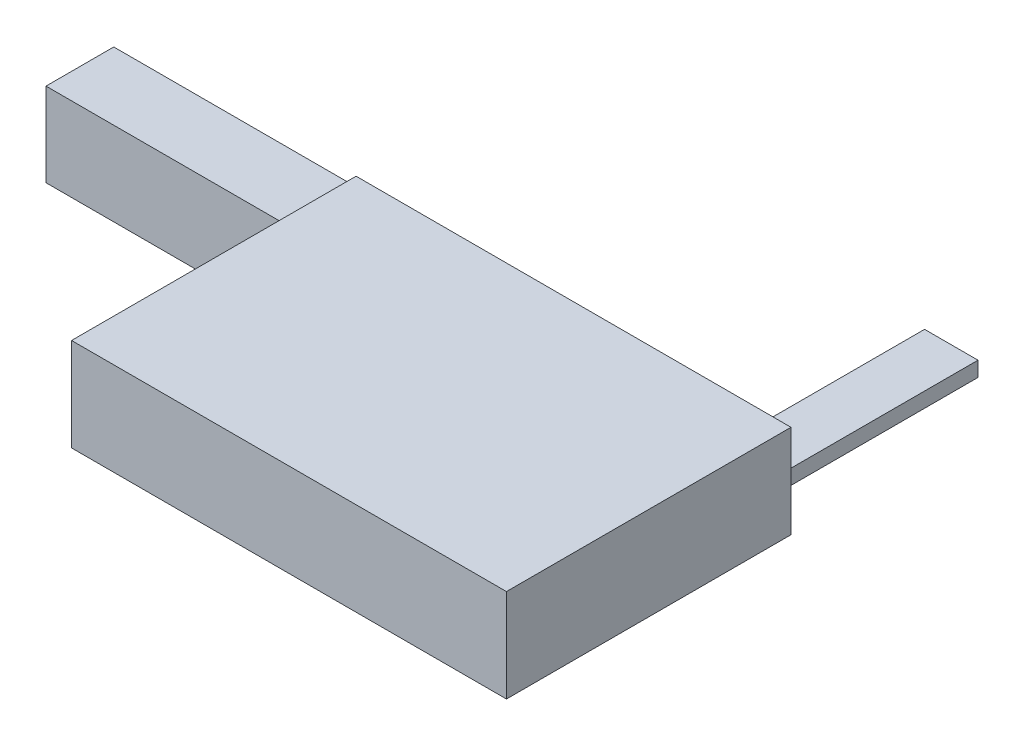
ISO-10303-21;
HEADER;
FILE_DESCRIPTION(('STEP AP214'),'2;1');
FILE_NAME('part.step','',(''),(''),'','','');
FILE_SCHEMA(('AUTOMOTIVE_DESIGN { 1 0 10303 214 1 1 1 1 }'));
ENDSEC;
DATA;
#1=APPLICATION_CONTEXT('core data for automotive mechanical design processes');
#2=APPLICATION_PROTOCOL_DEFINITION('international standard','automotive_design',2000,#1);
#3=PRODUCT_CONTEXT('',#1,'mechanical');
#4=PRODUCT('Part','Part','',(#3));
#5=PRODUCT_RELATED_PRODUCT_CATEGORY('part','',(#4));
#6=PRODUCT_DEFINITION_FORMATION('','',#4);
#7=PRODUCT_DEFINITION_CONTEXT('part definition',#1,'design');
#8=PRODUCT_DEFINITION('design','',#6,#7);
#9=PRODUCT_DEFINITION_SHAPE('','',#8);
#10=(LENGTH_UNIT() NAMED_UNIT(*) SI_UNIT(.MILLI.,.METRE.));
#11=(NAMED_UNIT(*) PLANE_ANGLE_UNIT() SI_UNIT($,.RADIAN.));
#12=(NAMED_UNIT(*) SI_UNIT($,.STERADIAN.) SOLID_ANGLE_UNIT());
#13=UNCERTAINTY_MEASURE_WITH_UNIT(LENGTH_MEASURE(1.E-05),#10,'distance_accuracy_value','');
#14=(GEOMETRIC_REPRESENTATION_CONTEXT(3) GLOBAL_UNCERTAINTY_ASSIGNED_CONTEXT((#13)) GLOBAL_UNIT_ASSIGNED_CONTEXT((#10,
#11,#12)) REPRESENTATION_CONTEXT('',''));
#15=CARTESIAN_POINT('',(0.,0.,0.));
#16=DIRECTION('',(0.,0.,1.));
#17=DIRECTION('',(1.,0.,0.));
#18=AXIS2_PLACEMENT_3D('',#15,#16,#17);
#19=CARTESIAN_POINT('',(-68.9663311951931,18.9,-21.5412378145606));
#20=DIRECTION('',(0.,0.,1.));
#21=DIRECTION('',(1.,0.,0.));
#22=AXIS2_PLACEMENT_3D('',#19,#20,#21);
#23=PLANE('',#22);
#24=DIRECTION('',(-1.,0.,0.));
#25=VECTOR('',#24,1.);
#26=CARTESIAN_POINT('',(-68.9663311951931,0.,-21.5412378145606));
#27=LINE('',#26,#25);
#28=CARTESIAN_POINT('',(19.3336688048069,0.,-21.5412378145606));
#29=VERTEX_POINT('',#28);
#30=CARTESIAN_POINT('',(-68.9663311951931,0.,-21.5412378145606));
#31=VERTEX_POINT('',#30);
#32=EDGE_CURVE('E185',#29,#31,#27,.T.);
#33=ORIENTED_EDGE('',*,*,#32,.T.);
#34=DIRECTION('',(0.,-1.,0.));
#35=VECTOR('',#34,1.);
#36=CARTESIAN_POINT('',(-68.9663311951931,18.9,-21.5412378145606));
#37=LINE('',#36,#35);
#38=CARTESIAN_POINT('',(-68.9663311951931,18.9,-21.5412378145606));
#39=VERTEX_POINT('',#38);
#40=EDGE_CURVE('E191',#39,#31,#37,.T.);
#41=ORIENTED_EDGE('',*,*,#40,.F.);
#42=DIRECTION('',(-1.,0.,0.));
#43=VECTOR('',#42,1.);
#44=CARTESIAN_POINT('',(-68.9663311951931,18.9,-21.5412378145606));
#45=LINE('',#44,#43);
#46=CARTESIAN_POINT('',(19.3336688048069,18.9,-21.5412378145606));
#47=VERTEX_POINT('',#46);
#48=EDGE_CURVE('E189',#47,#39,#45,.T.);
#49=ORIENTED_EDGE('',*,*,#48,.F.);
#50=DIRECTION('',(0.,-1.,0.));
#51=VECTOR('',#50,1.);
#52=CARTESIAN_POINT('',(19.3336688048069,18.9,-21.5412378145606));
#53=LINE('',#52,#51);
#54=EDGE_CURVE('E201',#47,#29,#53,.T.);
#55=ORIENTED_EDGE('',*,*,#54,.T.);
#56=EDGE_LOOP('',(#33,#41,#49,#55));
#57=FACE_BOUND('',#56,.T.);
#58=DIRECTION('',(0.,-1.,0.));
#59=VECTOR('',#58,1.);
#60=CARTESIAN_POINT('',(12.3031937464226,4.68327941976551,-21.5412378145606));
#61=LINE('',#60,#59);
#62=CARTESIAN_POINT('',(12.3031937464226,4.68327941976551,-21.5412378145606));
#63=VERTEX_POINT('',#62);
#64=CARTESIAN_POINT('',(12.3031937464226,1.64563042849727,-21.5412378145606));
#65=VERTEX_POINT('',#64);
#66=EDGE_CURVE('E141',#63,#65,#61,.T.);
#67=ORIENTED_EDGE('',*,*,#66,.F.);
#68=DIRECTION('',(1.,0.,0.));
#69=VECTOR('',#68,1.);
#70=CARTESIAN_POINT('',(12.3031937464226,4.68327941976551,-21.5412378145606));
#71=LINE('',#70,#69);
#72=CARTESIAN_POINT('',(1.45444734903608,4.68327941976551,-21.5412378145606));
#73=VERTEX_POINT('',#72);
#74=EDGE_CURVE('E138',#73,#63,#71,.T.);
#75=ORIENTED_EDGE('',*,*,#74,.F.);
#76=DIRECTION('',(0.,1.,0.));
#77=VECTOR('',#76,1.);
#78=CARTESIAN_POINT('',(1.45444734903608,4.68327941976551,-21.5412378145606));
#79=LINE('',#78,#77);
#80=CARTESIAN_POINT('',(1.45444734903608,1.64563042849727,-21.5412378145606));
#81=VERTEX_POINT('',#80);
#82=EDGE_CURVE('E52',#81,#73,#79,.T.);
#83=ORIENTED_EDGE('',*,*,#82,.F.);
#84=DIRECTION('',(-1.,0.,0.));
#85=VECTOR('',#84,1.);
#86=CARTESIAN_POINT('',(12.3031937464226,1.64563042849727,-21.5412378145606));
#87=LINE('',#86,#85);
#88=EDGE_CURVE('E47',#65,#81,#87,.T.);
#89=ORIENTED_EDGE('',*,*,#88,.F.);
#90=EDGE_LOOP('',(#67,#75,#83,#89));
#91=FACE_BOUND('',#90,.T.);
#92=ADVANCED_FACE('F32',(#57,#91),#23,.F.);
#93=CARTESIAN_POINT('',(-68.9663311951931,18.9,-21.5412378145606));
#94=DIRECTION('',(1.,0.,0.));
#95=DIRECTION('',(0.,0.,-1.));
#96=AXIS2_PLACEMENT_3D('',#93,#94,#95);
#97=PLANE('',#96);
#98=DIRECTION('',(0.,0.,1.));
#99=VECTOR('',#98,1.);
#100=CARTESIAN_POINT('',(-68.9663311951931,0.,-21.5412378145606));
#101=LINE('',#100,#99);
#102=CARTESIAN_POINT('',(-68.9663311951931,0.,36.2287621854394));
#103=VERTEX_POINT('',#102);
#104=EDGE_CURVE('E180',#31,#103,#101,.T.);
#105=ORIENTED_EDGE('',*,*,#104,.T.);
#106=DIRECTION('',(0.,-1.,0.));
#107=VECTOR('',#106,1.);
#108=CARTESIAN_POINT('',(-68.9663311951931,18.9,36.2287621854394));
#109=LINE('',#108,#107);
#110=CARTESIAN_POINT('',(-68.9663311951931,18.9,36.2287621854394));
#111=VERTEX_POINT('',#110);
#112=EDGE_CURVE('E11',#111,#103,#109,.T.);
#113=ORIENTED_EDGE('',*,*,#112,.F.);
#114=DIRECTION('',(0.,0.,1.));
#115=VECTOR('',#114,1.);
#116=CARTESIAN_POINT('',(-68.9663311951931,18.9,-21.5412378145606));
#117=LINE('',#116,#115);
#118=EDGE_CURVE('E181',#39,#111,#117,.T.);
#119=ORIENTED_EDGE('',*,*,#118,.F.);
#120=ORIENTED_EDGE('',*,*,#40,.T.);
#121=EDGE_LOOP('',(#105,#113,#119,#120));
#122=FACE_BOUND('',#121,.T.);
#123=DIRECTION('',(0.,-1.,0.));
#124=VECTOR('',#123,1.);
#125=CARTESIAN_POINT('',(-68.9663311951931,18.222786207606,-20.3427320089924));
#126=LINE('',#125,#124);
#127=CARTESIAN_POINT('',(-68.9663311951931,18.222786207606,-20.3427320089924));
#128=VERTEX_POINT('',#127);
#129=CARTESIAN_POINT('',(-68.9663311951931,1.22278620760602,-20.3427320089924));
#130=VERTEX_POINT('',#129);
#131=EDGE_CURVE('E142',#128,#130,#126,.T.);
#132=ORIENTED_EDGE('',*,*,#131,.F.);
#133=DIRECTION('',(0.,0.,-1.));
#134=VECTOR('',#133,1.);
#135=CARTESIAN_POINT('',(-68.9663311951931,18.222786207606,-20.3427320089924));
#136=LINE('',#135,#134);
#137=CARTESIAN_POINT('',(-68.9663311951931,18.222786207606,-6.58273200899241));
#138=VERTEX_POINT('',#137);
#139=EDGE_CURVE('E155',#138,#128,#136,.T.);
#140=ORIENTED_EDGE('',*,*,#139,.F.);
#141=DIRECTION('',(0.,1.,0.));
#142=VECTOR('',#141,1.);
#143=CARTESIAN_POINT('',(-68.9663311951931,18.222786207606,-6.58273200899241));
#144=LINE('',#143,#142);
#145=CARTESIAN_POINT('',(-68.9663311951931,1.22278620760602,-6.58273200899241));
#146=VERTEX_POINT('',#145);
#147=EDGE_CURVE('E164',#146,#138,#144,.T.);
#148=ORIENTED_EDGE('',*,*,#147,.F.);
#149=DIRECTION('',(0.,0.,1.));
#150=VECTOR('',#149,1.);
#151=CARTESIAN_POINT('',(-68.9663311951931,1.22278620760602,-20.3427320089924));
#152=LINE('',#151,#150);
#153=EDGE_CURVE('E145',#130,#146,#152,.T.);
#154=ORIENTED_EDGE('',*,*,#153,.F.);
#155=EDGE_LOOP('',(#132,#140,#148,#154));
#156=FACE_BOUND('',#155,.T.);
#157=ADVANCED_FACE('F34',(#122,#156),#97,.F.);
#158=CARTESIAN_POINT('',(-68.9663311951931,18.9,36.2287621854394));
#159=DIRECTION('',(0.,0.,-1.));
#160=DIRECTION('',(-1.,0.,0.));
#161=AXIS2_PLACEMENT_3D('',#158,#159,#160);
#162=PLANE('',#161);
#163=DIRECTION('',(1.,0.,0.));
#164=VECTOR('',#163,1.);
#165=CARTESIAN_POINT('',(-68.9663311951931,0.,36.2287621854394));
#166=LINE('',#165,#164);
#167=CARTESIAN_POINT('',(19.3336688048069,0.,36.2287621854394));
#168=VERTEX_POINT('',#167);
#169=EDGE_CURVE('E194',#103,#168,#166,.T.);
#170=ORIENTED_EDGE('',*,*,#169,.T.);
#171=DIRECTION('',(0.,-1.,0.));
#172=VECTOR('',#171,1.);
#173=CARTESIAN_POINT('',(19.3336688048069,18.9,36.2287621854394));
#174=LINE('',#173,#172);
#175=CARTESIAN_POINT('',(19.3336688048069,18.9,36.2287621854394));
#176=VERTEX_POINT('',#175);
#177=EDGE_CURVE('E40',#176,#168,#174,.T.);
#178=ORIENTED_EDGE('',*,*,#177,.F.);
#179=DIRECTION('',(1.,0.,0.));
#180=VECTOR('',#179,1.);
#181=CARTESIAN_POINT('',(-68.9663311951931,18.9,36.2287621854394));
#182=LINE('',#181,#180);
#183=EDGE_CURVE('E184',#111,#176,#182,.T.);
#184=ORIENTED_EDGE('',*,*,#183,.F.);
#185=ORIENTED_EDGE('',*,*,#112,.T.);
#186=EDGE_LOOP('',(#170,#178,#184,#185));
#187=FACE_BOUND('',#186,.T.);
#188=ADVANCED_FACE('F224',(#187),#162,.F.);
#189=CARTESIAN_POINT('',(19.3336688048069,18.9,-21.5412378145606));
#190=DIRECTION('',(-1.,0.,0.));
#191=DIRECTION('',(0.,0.,1.));
#192=AXIS2_PLACEMENT_3D('',#189,#190,#191);
#193=PLANE('',#192);
#194=DIRECTION('',(0.,0.,-1.));
#195=VECTOR('',#194,1.);
#196=CARTESIAN_POINT('',(19.3336688048069,0.,-21.5412378145606));
#197=LINE('',#196,#195);
#198=EDGE_CURVE('E196',#168,#29,#197,.T.);
#199=ORIENTED_EDGE('',*,*,#198,.T.);
#200=ORIENTED_EDGE('',*,*,#54,.F.);
#201=DIRECTION('',(0.,0.,-1.));
#202=VECTOR('',#201,1.);
#203=CARTESIAN_POINT('',(19.3336688048069,18.9,-21.5412378145606));
#204=LINE('',#203,#202);
#205=EDGE_CURVE('E187',#176,#47,#204,.T.);
#206=ORIENTED_EDGE('',*,*,#205,.F.);
#207=ORIENTED_EDGE('',*,*,#177,.T.);
#208=EDGE_LOOP('',(#199,#200,#206,#207));
#209=FACE_BOUND('',#208,.T.);
#210=ADVANCED_FACE('F208',(#209),#193,.F.);
#211=CARTESIAN_POINT('',(0.,18.9,0.));
#212=DIRECTION('',(0.,1.,0.));
#213=DIRECTION('',(0.,0.,1.));
#214=AXIS2_PLACEMENT_3D('',#211,#212,#213);
#215=PLANE('',#214);
#216=ORIENTED_EDGE('',*,*,#118,.T.);
#217=ORIENTED_EDGE('',*,*,#183,.T.);
#218=ORIENTED_EDGE('',*,*,#205,.T.);
#219=ORIENTED_EDGE('',*,*,#48,.T.);
#220=EDGE_LOOP('',(#216,#217,#218,#219));
#221=FACE_BOUND('',#220,.T.);
#222=ADVANCED_FACE('F223',(#221),#215,.T.);
#223=CARTESIAN_POINT('',(0.,0.,0.));
#224=DIRECTION('',(0.,1.,0.));
#225=DIRECTION('',(0.,0.,1.));
#226=AXIS2_PLACEMENT_3D('',#223,#224,#225);
#227=PLANE('',#226);
#228=ORIENTED_EDGE('',*,*,#104,.F.);
#229=ORIENTED_EDGE('',*,*,#32,.F.);
#230=ORIENTED_EDGE('',*,*,#198,.F.);
#231=ORIENTED_EDGE('',*,*,#169,.F.);
#232=EDGE_LOOP('',(#228,#229,#230,#231));
#233=FACE_BOUND('',#232,.T.);
#234=ADVANCED_FACE('F214',(#233),#227,.F.);
#235=CARTESIAN_POINT('',(-116.966331195193,18.222786207606,-20.3427320089924));
#236=DIRECTION('',(0.,0.,1.));
#237=DIRECTION('',(0.,-1.,0.));
#238=AXIS2_PLACEMENT_3D('',#235,#236,#237);
#239=PLANE('',#238);
#240=ORIENTED_EDGE('',*,*,#131,.T.);
#241=DIRECTION('',(1.,0.,0.));
#242=VECTOR('',#241,1.);
#243=CARTESIAN_POINT('',(-116.966331195193,1.22278620760602,-20.3427320089924));
#244=LINE('',#243,#242);
#245=CARTESIAN_POINT('',(-116.966331195193,1.22278620760602,-20.3427320089924));
#246=VERTEX_POINT('',#245);
#247=EDGE_CURVE('E177',#246,#130,#244,.T.);
#248=ORIENTED_EDGE('',*,*,#247,.F.);
#249=DIRECTION('',(0.,-1.,0.));
#250=VECTOR('',#249,1.);
#251=CARTESIAN_POINT('',(-116.966331195193,18.222786207606,-20.3427320089924));
#252=LINE('',#251,#250);
#253=CARTESIAN_POINT('',(-116.966331195193,18.222786207606,-20.3427320089924));
#254=VERTEX_POINT('',#253);
#255=EDGE_CURVE('E151',#254,#246,#252,.T.);
#256=ORIENTED_EDGE('',*,*,#255,.F.);
#257=DIRECTION('',(1.,0.,0.));
#258=VECTOR('',#257,1.);
#259=CARTESIAN_POINT('',(-116.966331195193,18.222786207606,-20.3427320089924));
#260=LINE('',#259,#258);
#261=EDGE_CURVE('E160',#254,#128,#260,.T.);
#262=ORIENTED_EDGE('',*,*,#261,.T.);
#263=EDGE_LOOP('',(#240,#248,#256,#262));
#264=FACE_BOUND('',#263,.T.);
#265=ADVANCED_FACE('F238',(#264),#239,.F.);
#266=CARTESIAN_POINT('',(-116.966331195193,1.22278620760602,-20.3427320089924));
#267=DIRECTION('',(0.,1.,0.));
#268=DIRECTION('',(0.,0.,1.));
#269=AXIS2_PLACEMENT_3D('',#266,#267,#268);
#270=PLANE('',#269);
#271=ORIENTED_EDGE('',*,*,#153,.T.);
#272=DIRECTION('',(1.,0.,0.));
#273=VECTOR('',#272,1.);
#274=CARTESIAN_POINT('',(-116.966331195193,1.22278620760602,-6.58273200899241));
#275=LINE('',#274,#273);
#276=CARTESIAN_POINT('',(-116.966331195193,1.22278620760602,-6.58273200899241));
#277=VERTEX_POINT('',#276);
#278=EDGE_CURVE('E174',#277,#146,#275,.T.);
#279=ORIENTED_EDGE('',*,*,#278,.F.);
#280=DIRECTION('',(0.,0.,1.));
#281=VECTOR('',#280,1.);
#282=CARTESIAN_POINT('',(-116.966331195193,1.22278620760602,-20.3427320089924));
#283=LINE('',#282,#281);
#284=EDGE_CURVE('E154',#246,#277,#283,.T.);
#285=ORIENTED_EDGE('',*,*,#284,.F.);
#286=ORIENTED_EDGE('',*,*,#247,.T.);
#287=EDGE_LOOP('',(#271,#279,#285,#286));
#288=FACE_BOUND('',#287,.T.);
#289=ADVANCED_FACE('F243',(#288),#270,.F.);
#290=CARTESIAN_POINT('',(-116.966331195193,18.222786207606,-6.58273200899241));
#291=DIRECTION('',(0.,0.,-1.));
#292=DIRECTION('',(-1.,0.,0.));
#293=AXIS2_PLACEMENT_3D('',#290,#291,#292);
#294=PLANE('',#293);
#295=ORIENTED_EDGE('',*,*,#147,.T.);
#296=DIRECTION('',(1.,0.,0.));
#297=VECTOR('',#296,1.);
#298=CARTESIAN_POINT('',(-116.966331195193,18.222786207606,-6.58273200899241));
#299=LINE('',#298,#297);
#300=CARTESIAN_POINT('',(-116.966331195193,18.222786207606,-6.58273200899241));
#301=VERTEX_POINT('',#300);
#302=EDGE_CURVE('E171',#301,#138,#299,.T.);
#303=ORIENTED_EDGE('',*,*,#302,.F.);
#304=DIRECTION('',(0.,1.,0.));
#305=VECTOR('',#304,1.);
#306=CARTESIAN_POINT('',(-116.966331195193,18.222786207606,-6.58273200899241));
#307=LINE('',#306,#305);
#308=EDGE_CURVE('E157',#277,#301,#307,.T.);
#309=ORIENTED_EDGE('',*,*,#308,.F.);
#310=ORIENTED_EDGE('',*,*,#278,.T.);
#311=EDGE_LOOP('',(#295,#303,#309,#310));
#312=FACE_BOUND('',#311,.T.);
#313=ADVANCED_FACE('F247',(#312),#294,.F.);
#314=CARTESIAN_POINT('',(-116.966331195193,18.222786207606,-20.3427320089924));
#315=DIRECTION('',(0.,-1.,0.));
#316=DIRECTION('',(0.,0.,-1.));
#317=AXIS2_PLACEMENT_3D('',#314,#315,#316);
#318=PLANE('',#317);
#319=ORIENTED_EDGE('',*,*,#139,.T.);
#320=ORIENTED_EDGE('',*,*,#261,.F.);
#321=DIRECTION('',(0.,0.,-1.));
#322=VECTOR('',#321,1.);
#323=CARTESIAN_POINT('',(-116.966331195193,18.222786207606,-20.3427320089924));
#324=LINE('',#323,#322);
#325=EDGE_CURVE('E159',#301,#254,#324,.T.);
#326=ORIENTED_EDGE('',*,*,#325,.F.);
#327=ORIENTED_EDGE('',*,*,#302,.T.);
#328=EDGE_LOOP('',(#319,#320,#326,#327));
#329=FACE_BOUND('',#328,.T.);
#330=ADVANCED_FACE('F251',(#329),#318,.F.);
#331=CARTESIAN_POINT('',(-116.966331195193,0.,0.));
#332=DIRECTION('',(-1.,0.,0.));
#333=DIRECTION('',(0.,0.,1.));
#334=AXIS2_PLACEMENT_3D('',#331,#332,#333);
#335=PLANE('',#334);
#336=ORIENTED_EDGE('',*,*,#255,.T.);
#337=ORIENTED_EDGE('',*,*,#284,.T.);
#338=ORIENTED_EDGE('',*,*,#308,.T.);
#339=ORIENTED_EDGE('',*,*,#325,.T.);
#340=EDGE_LOOP('',(#336,#337,#338,#339));
#341=FACE_BOUND('',#340,.T.);
#342=ADVANCED_FACE('F255',(#341),#335,.T.);
#343=CARTESIAN_POINT('',(12.3031937464226,4.68327941976551,-66.5412378145606));
#344=DIRECTION('',(-1.,0.,0.));
#345=DIRECTION('',(0.,0.,1.));
#346=AXIS2_PLACEMENT_3D('',#343,#344,#345);
#347=PLANE('',#346);
#348=ORIENTED_EDGE('',*,*,#66,.T.);
#349=DIRECTION('',(0.,0.,1.));
#350=VECTOR('',#349,1.);
#351=CARTESIAN_POINT('',(12.3031937464226,1.64563042849727,-66.5412378145606));
#352=LINE('',#351,#350);
#353=CARTESIAN_POINT('',(12.3031937464226,1.64563042849727,-66.5412378145606));
#354=VERTEX_POINT('',#353);
#355=EDGE_CURVE('E122',#354,#65,#352,.T.);
#356=ORIENTED_EDGE('',*,*,#355,.F.);
#357=DIRECTION('',(0.,-1.,0.));
#358=VECTOR('',#357,1.);
#359=CARTESIAN_POINT('',(12.3031937464226,4.68327941976551,-66.5412378145606));
#360=LINE('',#359,#358);
#361=CARTESIAN_POINT('',(12.3031937464226,4.68327941976551,-66.5412378145606));
#362=VERTEX_POINT('',#361);
#363=EDGE_CURVE('E129',#362,#354,#360,.T.);
#364=ORIENTED_EDGE('',*,*,#363,.F.);
#365=DIRECTION('',(0.,0.,1.));
#366=VECTOR('',#365,1.);
#367=CARTESIAN_POINT('',(12.3031937464226,4.68327941976551,-66.5412378145606));
#368=LINE('',#367,#366);
#369=EDGE_CURVE('E367',#362,#63,#368,.T.);
#370=ORIENTED_EDGE('',*,*,#369,.T.);
#371=EDGE_LOOP('',(#348,#356,#364,#370));
#372=FACE_BOUND('',#371,.T.);
#373=ADVANCED_FACE('F140',(#372),#347,.F.);
#374=CARTESIAN_POINT('',(12.3031937464226,1.64563042849727,-66.5412378145606));
#375=DIRECTION('',(0.,1.,0.));
#376=DIRECTION('',(0.,0.,1.));
#377=AXIS2_PLACEMENT_3D('',#374,#375,#376);
#378=PLANE('',#377);
#379=ORIENTED_EDGE('',*,*,#88,.T.);
#380=DIRECTION('',(0.,0.,1.));
#381=VECTOR('',#380,1.);
#382=CARTESIAN_POINT('',(1.45444734903608,1.64563042849727,-66.5412378145606));
#383=LINE('',#382,#381);
#384=CARTESIAN_POINT('',(1.45444734903608,1.64563042849727,-66.5412378145606));
#385=VERTEX_POINT('',#384);
#386=EDGE_CURVE('E125',#385,#81,#383,.T.);
#387=ORIENTED_EDGE('',*,*,#386,.F.);
#388=DIRECTION('',(-1.,0.,0.));
#389=VECTOR('',#388,1.);
#390=CARTESIAN_POINT('',(12.3031937464226,1.64563042849727,-66.5412378145606));
#391=LINE('',#390,#389);
#392=EDGE_CURVE('E118',#354,#385,#391,.T.);
#393=ORIENTED_EDGE('',*,*,#392,.F.);
#394=ORIENTED_EDGE('',*,*,#355,.T.);
#395=EDGE_LOOP('',(#379,#387,#393,#394));
#396=FACE_BOUND('',#395,.T.);
#397=ADVANCED_FACE('F120',(#396),#378,.F.);
#398=CARTESIAN_POINT('',(1.45444734903608,4.68327941976551,-66.5412378145606));
#399=DIRECTION('',(1.,0.,0.));
#400=DIRECTION('',(0.,0.,-1.));
#401=AXIS2_PLACEMENT_3D('',#398,#399,#400);
#402=PLANE('',#401);
#403=ORIENTED_EDGE('',*,*,#82,.T.);
#404=DIRECTION('',(0.,0.,1.));
#405=VECTOR('',#404,1.);
#406=CARTESIAN_POINT('',(1.45444734903608,4.68327941976551,-66.5412378145606));
#407=LINE('',#406,#405);
#408=CARTESIAN_POINT('',(1.45444734903608,4.68327941976551,-66.5412378145606));
#409=VERTEX_POINT('',#408);
#410=EDGE_CURVE('E147',#409,#73,#407,.T.);
#411=ORIENTED_EDGE('',*,*,#410,.F.);
#412=DIRECTION('',(0.,1.,0.));
#413=VECTOR('',#412,1.);
#414=CARTESIAN_POINT('',(1.45444734903608,4.68327941976551,-66.5412378145606));
#415=LINE('',#414,#413);
#416=EDGE_CURVE('E128',#385,#409,#415,.T.);
#417=ORIENTED_EDGE('',*,*,#416,.F.);
#418=ORIENTED_EDGE('',*,*,#386,.T.);
#419=EDGE_LOOP('',(#403,#411,#417,#418));
#420=FACE_BOUND('',#419,.T.);
#421=ADVANCED_FACE('F264',(#420),#402,.F.);
#422=CARTESIAN_POINT('',(12.3031937464226,4.68327941976551,-66.5412378145606));
#423=DIRECTION('',(0.,-1.,0.));
#424=DIRECTION('',(0.,0.,-1.));
#425=AXIS2_PLACEMENT_3D('',#422,#423,#424);
#426=PLANE('',#425);
#427=ORIENTED_EDGE('',*,*,#74,.T.);
#428=ORIENTED_EDGE('',*,*,#369,.F.);
#429=DIRECTION('',(1.,0.,0.));
#430=VECTOR('',#429,1.);
#431=CARTESIAN_POINT('',(12.3031937464226,4.68327941976551,-66.5412378145606));
#432=LINE('',#431,#430);
#433=EDGE_CURVE('E134',#409,#362,#432,.T.);
#434=ORIENTED_EDGE('',*,*,#433,.F.);
#435=ORIENTED_EDGE('',*,*,#410,.T.);
#436=EDGE_LOOP('',(#427,#428,#434,#435));
#437=FACE_BOUND('',#436,.T.);
#438=ADVANCED_FACE('F267',(#437),#426,.F.);
#439=CARTESIAN_POINT('',(0.,0.,-66.5412378145606));
#440=DIRECTION('',(0.,0.,-1.));
#441=DIRECTION('',(-1.,0.,0.));
#442=AXIS2_PLACEMENT_3D('',#439,#440,#441);
#443=PLANE('',#442);
#444=ORIENTED_EDGE('',*,*,#363,.T.);
#445=ORIENTED_EDGE('',*,*,#392,.T.);
#446=ORIENTED_EDGE('',*,*,#416,.T.);
#447=ORIENTED_EDGE('',*,*,#433,.T.);
#448=EDGE_LOOP('',(#444,#445,#446,#447));
#449=FACE_BOUND('',#448,.T.);
#450=ADVANCED_FACE('F132',(#449),#443,.T.);
#451=CLOSED_SHELL('',(#92,#157,#188,#210,#222,#234,#265,#289,#313,#330,#342,#373,#397,#421,#438,#450));
#452=MANIFOLD_SOLID_BREP('B2',#451);
#453=ADVANCED_BREP_SHAPE_REPRESENTATION('',(#18,#452),#14);
#454=SHAPE_DEFINITION_REPRESENTATION(#9,#453);
ENDSEC;
END-ISO-10303-21;
